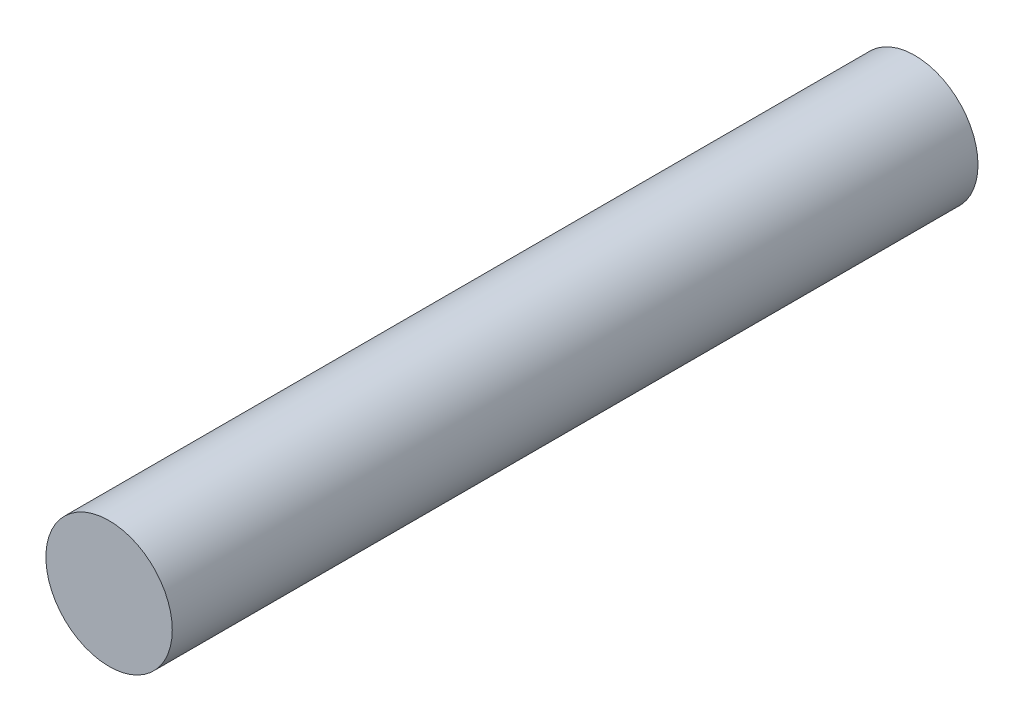
ISO-10303-21;
HEADER;
FILE_DESCRIPTION(('STEP AP214'),'2;1');
FILE_NAME('part.step','',(''),(''),'','','');
FILE_SCHEMA(('AUTOMOTIVE_DESIGN { 1 0 10303 214 1 1 1 1 }'));
ENDSEC;
DATA;
#1=APPLICATION_CONTEXT('core data for automotive mechanical design processes');
#2=APPLICATION_PROTOCOL_DEFINITION('international standard','automotive_design',2000,#1);
#3=PRODUCT_CONTEXT('',#1,'mechanical');
#4=PRODUCT('Part','Part','',(#3));
#5=PRODUCT_RELATED_PRODUCT_CATEGORY('part','',(#4));
#6=PRODUCT_DEFINITION_FORMATION('','',#4);
#7=PRODUCT_DEFINITION_CONTEXT('part definition',#1,'design');
#8=PRODUCT_DEFINITION('design','',#6,#7);
#9=PRODUCT_DEFINITION_SHAPE('','',#8);
#10=(LENGTH_UNIT() NAMED_UNIT(*) SI_UNIT(.MILLI.,.METRE.));
#11=(NAMED_UNIT(*) PLANE_ANGLE_UNIT() SI_UNIT($,.RADIAN.));
#12=(NAMED_UNIT(*) SI_UNIT($,.STERADIAN.) SOLID_ANGLE_UNIT());
#13=UNCERTAINTY_MEASURE_WITH_UNIT(LENGTH_MEASURE(1.E-05),#10,'distance_accuracy_value','');
#14=(GEOMETRIC_REPRESENTATION_CONTEXT(3) GLOBAL_UNCERTAINTY_ASSIGNED_CONTEXT((#13)) GLOBAL_UNIT_ASSIGNED_CONTEXT((#10,
#11,#12)) REPRESENTATION_CONTEXT('',''));
#15=CARTESIAN_POINT('',(0.,0.,0.));
#16=DIRECTION('',(0.,0.,1.));
#17=DIRECTION('',(1.,0.,0.));
#18=AXIS2_PLACEMENT_3D('',#15,#16,#17);
#19=CARTESIAN_POINT('',(0.,0.,51.));
#20=DIRECTION('',(0.,0.,-1.));
#21=DIRECTION('',(-1.,0.,0.));
#22=AXIS2_PLACEMENT_3D('',#19,#20,#21);
#23=CYLINDRICAL_SURFACE('',#22,4.);
#24=CARTESIAN_POINT('',(0.,0.,51.));
#25=DIRECTION('',(0.,0.,1.));
#26=DIRECTION('',(1.,0.,0.));
#27=AXIS2_PLACEMENT_3D('',#24,#25,#26);
#28=CIRCLE('',#27,4.);
#29=CARTESIAN_POINT('',(4.,0.,51.));
#30=VERTEX_POINT('',#29);
#31=EDGE_CURVE('E10',#30,#30,#28,.T.);
#32=ORIENTED_EDGE('',*,*,#31,.F.);
#33=EDGE_LOOP('',(#32));
#34=FACE_BOUND('',#33,.T.);
#35=CARTESIAN_POINT('',(0.,0.,0.));
#36=DIRECTION('',(0.,0.,1.));
#37=DIRECTION('',(1.,0.,0.));
#38=AXIS2_PLACEMENT_3D('',#35,#36,#37);
#39=CIRCLE('',#38,4.);
#40=CARTESIAN_POINT('',(4.,0.,0.));
#41=VERTEX_POINT('',#40);
#42=EDGE_CURVE('E35',#41,#41,#39,.T.);
#43=ORIENTED_EDGE('',*,*,#42,.T.);
#44=EDGE_LOOP('',(#43));
#45=FACE_BOUND('',#44,.T.);
#46=ADVANCED_FACE('F32',(#34,#45),#23,.T.);
#47=CARTESIAN_POINT('',(0.,0.,51.));
#48=DIRECTION('',(0.,0.,1.));
#49=DIRECTION('',(1.,0.,0.));
#50=AXIS2_PLACEMENT_3D('',#47,#48,#49);
#51=PLANE('',#50);
#52=ORIENTED_EDGE('',*,*,#31,.T.);
#53=EDGE_LOOP('',(#52));
#54=FACE_BOUND('',#53,.T.);
#55=ADVANCED_FACE('F47',(#54),#51,.T.);
#56=CARTESIAN_POINT('',(0.,0.,0.));
#57=DIRECTION('',(0.,0.,1.));
#58=DIRECTION('',(1.,0.,0.));
#59=AXIS2_PLACEMENT_3D('',#56,#57,#58);
#60=PLANE('',#59);
#61=ORIENTED_EDGE('',*,*,#42,.F.);
#62=EDGE_LOOP('',(#61));
#63=FACE_BOUND('',#62,.T.);
#64=ADVANCED_FACE('F45',(#63),#60,.F.);
#65=CLOSED_SHELL('',(#46,#55,#64));
#66=MANIFOLD_SOLID_BREP('B2',#65);
#67=ADVANCED_BREP_SHAPE_REPRESENTATION('',(#18,#66),#14);
#68=SHAPE_DEFINITION_REPRESENTATION(#9,#67);
ENDSEC;
END-ISO-10303-21;
